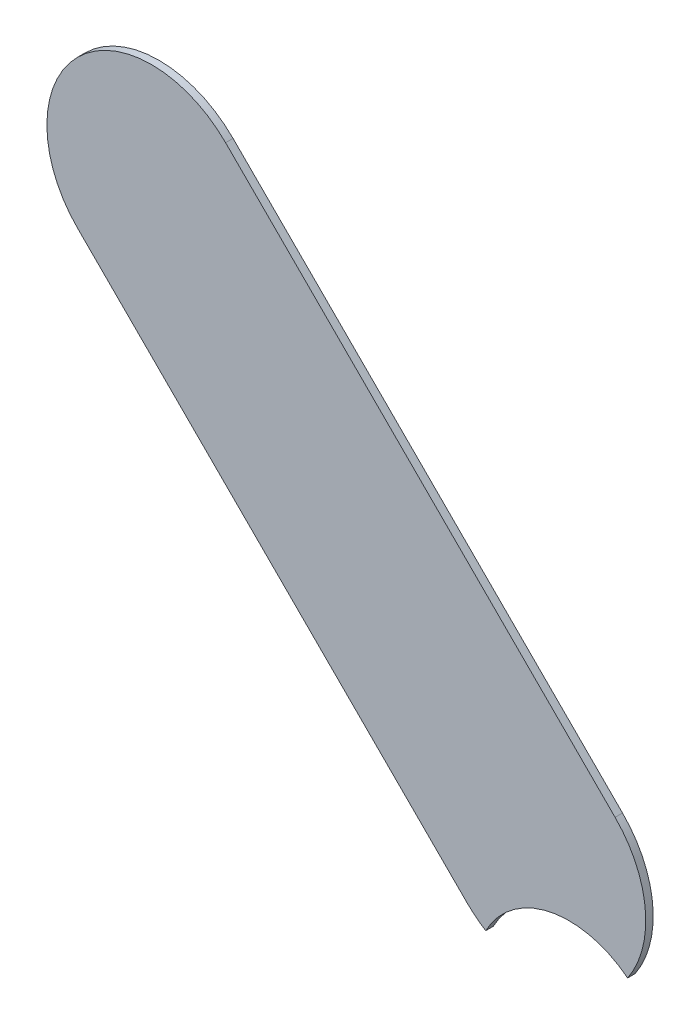
ISO-10303-21;
HEADER;
FILE_DESCRIPTION(('STEP AP214'),'2;1');
FILE_NAME('part.step','',(''),(''),'','','');
FILE_SCHEMA(('AUTOMOTIVE_DESIGN { 1 0 10303 214 1 1 1 1 }'));
ENDSEC;
DATA;
#1=APPLICATION_CONTEXT('core data for automotive mechanical design processes');
#2=APPLICATION_PROTOCOL_DEFINITION('international standard','automotive_design',2000,#1);
#3=PRODUCT_CONTEXT('',#1,'mechanical');
#4=PRODUCT('Part','Part','',(#3));
#5=PRODUCT_RELATED_PRODUCT_CATEGORY('part','',(#4));
#6=PRODUCT_DEFINITION_FORMATION('','',#4);
#7=PRODUCT_DEFINITION_CONTEXT('part definition',#1,'design');
#8=PRODUCT_DEFINITION('design','',#6,#7);
#9=PRODUCT_DEFINITION_SHAPE('','',#8);
#10=(LENGTH_UNIT() NAMED_UNIT(*) SI_UNIT(.MILLI.,.METRE.));
#11=(NAMED_UNIT(*) PLANE_ANGLE_UNIT() SI_UNIT($,.RADIAN.));
#12=(NAMED_UNIT(*) SI_UNIT($,.STERADIAN.) SOLID_ANGLE_UNIT());
#13=UNCERTAINTY_MEASURE_WITH_UNIT(LENGTH_MEASURE(1.E-05),#10,'distance_accuracy_value','');
#14=(GEOMETRIC_REPRESENTATION_CONTEXT(3) GLOBAL_UNCERTAINTY_ASSIGNED_CONTEXT((#13)) GLOBAL_UNIT_ASSIGNED_CONTEXT((#10,
#11,#12)) REPRESENTATION_CONTEXT('',''));
#15=CARTESIAN_POINT('',(0.,0.,0.));
#16=DIRECTION('',(0.,0.,1.));
#17=DIRECTION('',(1.,0.,0.));
#18=AXIS2_PLACEMENT_3D('',#15,#16,#17);
#19=CARTESIAN_POINT('',(43.65225712,70.54063616,0.));
#20=DIRECTION('',(0.707106781186548,0.707106781186548,0.));
#21=DIRECTION('',(0.707106781186548,-0.707106781186548,0.));
#22=AXIS2_PLACEMENT_3D('',#19,#20,#21);
#23=PLANE('',#22);
#24=DIRECTION('',(0.707106781186548,-0.707106781186548,0.));
#25=VECTOR('',#24,1.);
#26=CARTESIAN_POINT('',(43.65225712,70.54063616,0.03556));
#27=LINE('',#26,#25);
#28=CARTESIAN_POINT('',(43.65225712,70.54063616,0.03556));
#29=VERTEX_POINT('',#28);
#30=CARTESIAN_POINT('',(45.5125201,68.68037318,0.03556));
#31=VERTEX_POINT('',#30);
#32=EDGE_CURVE('E11',#29,#31,#27,.T.);
#33=ORIENTED_EDGE('',*,*,#32,.F.);
#34=DIRECTION('',(0.,0.,1.));
#35=VECTOR('',#34,1.);
#36=CARTESIAN_POINT('',(43.65225712,70.54063616,0.));
#37=LINE('',#36,#35);
#38=CARTESIAN_POINT('',(43.65225712,70.54063616,0.));
#39=VERTEX_POINT('',#38);
#40=EDGE_CURVE('E24',#39,#29,#37,.T.);
#41=ORIENTED_EDGE('',*,*,#40,.F.);
#42=DIRECTION('',(0.707106781186548,-0.707106781186548,0.));
#43=VECTOR('',#42,1.);
#44=CARTESIAN_POINT('',(43.65225712,70.54063616,0.));
#45=LINE('',#44,#43);
#46=CARTESIAN_POINT('',(45.5125201,68.68037318,0.));
#47=VERTEX_POINT('',#46);
#48=EDGE_CURVE('E88',#39,#47,#45,.T.);
#49=ORIENTED_EDGE('',*,*,#48,.T.);
#50=DIRECTION('',(0.,0.,1.));
#51=VECTOR('',#50,1.);
#52=CARTESIAN_POINT('',(45.5125201,68.68037318,0.));
#53=LINE('',#52,#51);
#54=EDGE_CURVE('E37',#47,#31,#53,.T.);
#55=ORIENTED_EDGE('',*,*,#54,.T.);
#56=EDGE_LOOP('',(#33,#41,#49,#55));
#57=FACE_BOUND('',#56,.T.);
#58=ADVANCED_FACE('F17',(#57),#23,.F.);
#59=CARTESIAN_POINT('',(45.86607286,69.03392594,0.));
#60=DIRECTION('',(0.,0.,-1.));
#61=DIRECTION('',(-0.707106781186548,-0.707106781186548,0.));
#62=AXIS2_PLACEMENT_3D('',#59,#60,#61);
#63=CYLINDRICAL_SURFACE('',#62,0.499999108206442);
#64=CARTESIAN_POINT('',(45.86607286,69.03392594,0.03556));
#65=DIRECTION('',(0.,0.,1.));
#66=DIRECTION('',(-0.707106781186548,-0.707106781186548,0.));
#67=AXIS2_PLACEMENT_3D('',#64,#65,#66);
#68=CIRCLE('',#67,0.499999108206442);
#69=CARTESIAN_POINT('',(45.6017477531662,68.6095071066472,0.03556));
#70=VERTEX_POINT('',#69);
#71=EDGE_CURVE('E111',#31,#70,#68,.T.);
#72=ORIENTED_EDGE('',*,*,#71,.F.);
#73=ORIENTED_EDGE('',*,*,#54,.F.);
#74=CARTESIAN_POINT('',(45.86607286,69.03392594,0.));
#75=DIRECTION('',(0.,0.,1.));
#76=DIRECTION('',(-0.707106781186548,-0.707106781186548,0.));
#77=AXIS2_PLACEMENT_3D('',#74,#75,#76);
#78=CIRCLE('',#77,0.499999108206442);
#79=CARTESIAN_POINT('',(45.6017477531662,68.6095071066472,0.));
#80=VERTEX_POINT('',#79);
#81=EDGE_CURVE('E108',#47,#80,#78,.T.);
#82=ORIENTED_EDGE('',*,*,#81,.T.);
#83=DIRECTION('',(0.,0.,1.));
#84=VECTOR('',#83,1.);
#85=CARTESIAN_POINT('',(45.6017477531662,68.6095071066472,0.));
#86=LINE('',#85,#84);
#87=EDGE_CURVE('E106',#80,#70,#86,.T.);
#88=ORIENTED_EDGE('',*,*,#87,.T.);
#89=EDGE_LOOP('',(#72,#73,#82,#88));
#90=FACE_BOUND('',#89,.T.);
#91=ADVANCED_FACE('F118',(#90),#63,.T.);
#92=CARTESIAN_POINT('',(46.0000096,68.4000156,0.));
#93=DIRECTION('',(0.,0.,-1.));
#94=DIRECTION('',(1.,0.,0.));
#95=AXIS2_PLACEMENT_3D('',#92,#93,#94);
#96=CYLINDRICAL_SURFACE('',#95,0.4499991);
#97=DIRECTION('',(0.,0.,1.));
#98=VECTOR('',#97,1.);
#99=CARTESIAN_POINT('',(46.279490177413,68.752704977285,0.));
#100=LINE('',#99,#98);
#101=CARTESIAN_POINT('',(46.279490177413,68.752704977285,0.));
#102=VERTEX_POINT('',#101);
#103=CARTESIAN_POINT('',(46.279490177413,68.752704977285,0.03556));
#104=VERTEX_POINT('',#103);
#105=EDGE_CURVE('E104',#102,#104,#100,.T.);
#106=ORIENTED_EDGE('',*,*,#105,.T.);
#107=CARTESIAN_POINT('',(46.0000096,68.4000156,0.03556));
#108=DIRECTION('',(0.,0.,1.));
#109=DIRECTION('',(1.,0.,0.));
#110=AXIS2_PLACEMENT_3D('',#107,#108,#109);
#111=CIRCLE('',#110,0.4499991);
#112=EDGE_CURVE('E101',#104,#70,#111,.T.);
#113=ORIENTED_EDGE('',*,*,#112,.T.);
#114=ORIENTED_EDGE('',*,*,#87,.F.);
#115=CARTESIAN_POINT('',(46.0000096,68.4000156,0.));
#116=DIRECTION('',(0.,0.,1.));
#117=DIRECTION('',(1.,0.,0.));
#118=AXIS2_PLACEMENT_3D('',#115,#116,#117);
#119=CIRCLE('',#118,0.4499991);
#120=EDGE_CURVE('E98',#102,#80,#119,.T.);
#121=ORIENTED_EDGE('',*,*,#120,.F.);
#122=EDGE_LOOP('',(#106,#113,#114,#121));
#123=FACE_BOUND('',#122,.T.);
#124=ADVANCED_FACE('F124',(#123),#96,.F.);
#125=CARTESIAN_POINT('',(45.86607286,69.03392594,0.));
#126=DIRECTION('',(0.,0.,-1.));
#127=DIRECTION('',(-0.707106781186548,-0.707106781186548,0.));
#128=AXIS2_PLACEMENT_3D('',#125,#126,#127);
#129=CYLINDRICAL_SURFACE('',#128,0.499999108206442);
#130=CARTESIAN_POINT('',(45.86607286,69.03392594,0.03556));
#131=DIRECTION('',(0.,0.,1.));
#132=DIRECTION('',(-0.707106781186548,-0.707106781186548,0.));
#133=AXIS2_PLACEMENT_3D('',#130,#131,#132);
#134=CIRCLE('',#133,0.499999108206442);
#135=CARTESIAN_POINT('',(46.21962562,69.3874787,0.03556));
#136=VERTEX_POINT('',#135);
#137=EDGE_CURVE('E95',#104,#136,#134,.T.);
#138=ORIENTED_EDGE('',*,*,#137,.F.);
#139=ORIENTED_EDGE('',*,*,#105,.F.);
#140=CARTESIAN_POINT('',(46.21962562,69.3874787,0.));
#141=VERTEX_POINT('',#140);
#142=EDGE_CURVE('E94',#102,#141,#78,.T.);
#143=ORIENTED_EDGE('',*,*,#142,.T.);
#144=DIRECTION('',(0.,0.,1.));
#145=VECTOR('',#144,1.);
#146=CARTESIAN_POINT('',(46.21962562,69.3874787,0.));
#147=LINE('',#146,#145);
#148=EDGE_CURVE('E79',#141,#136,#147,.T.);
#149=ORIENTED_EDGE('',*,*,#148,.T.);
#150=EDGE_LOOP('',(#138,#139,#143,#149));
#151=FACE_BOUND('',#150,.T.);
#152=ADVANCED_FACE('F126',(#151),#129,.T.);
#153=CARTESIAN_POINT('',(46.21962562,69.3874787,0.));
#154=DIRECTION('',(-0.707106781186548,-0.707106781186548,0.));
#155=DIRECTION('',(-0.707106781186548,0.707106781186548,0.));
#156=AXIS2_PLACEMENT_3D('',#153,#154,#155);
#157=PLANE('',#156);
#158=DIRECTION('',(-0.707106781186548,0.707106781186548,0.));
#159=VECTOR('',#158,1.);
#160=CARTESIAN_POINT('',(46.21962562,69.3874787,0.03556));
#161=LINE('',#160,#159);
#162=CARTESIAN_POINT('',(44.35936264,71.24774168,0.03556));
#163=VERTEX_POINT('',#162);
#164=EDGE_CURVE('E83',#136,#163,#161,.T.);
#165=ORIENTED_EDGE('',*,*,#164,.F.);
#166=ORIENTED_EDGE('',*,*,#148,.F.);
#167=DIRECTION('',(-0.707106781186548,0.707106781186548,0.));
#168=VECTOR('',#167,1.);
#169=CARTESIAN_POINT('',(46.21962562,69.3874787,0.));
#170=LINE('',#169,#168);
#171=CARTESIAN_POINT('',(44.35936264,71.24774168,0.));
#172=VERTEX_POINT('',#171);
#173=EDGE_CURVE('E75',#141,#172,#170,.T.);
#174=ORIENTED_EDGE('',*,*,#173,.T.);
#175=DIRECTION('',(0.,0.,1.));
#176=VECTOR('',#175,1.);
#177=CARTESIAN_POINT('',(44.35936264,71.24774168,0.));
#178=LINE('',#177,#176);
#179=EDGE_CURVE('E65',#172,#163,#178,.T.);
#180=ORIENTED_EDGE('',*,*,#179,.T.);
#181=EDGE_LOOP('',(#165,#166,#174,#180));
#182=FACE_BOUND('',#181,.T.);
#183=ADVANCED_FACE('F78',(#182),#157,.F.);
#184=CARTESIAN_POINT('',(44.00580988,70.89418892,0.));
#185=DIRECTION('',(0.,0.,-1.));
#186=DIRECTION('',(0.707106781186548,0.707106781186548,0.));
#187=AXIS2_PLACEMENT_3D('',#184,#185,#186);
#188=CYLINDRICAL_SURFACE('',#187,0.499999108206442);
#189=CARTESIAN_POINT('',(44.00580988,70.89418892,0.03556));
#190=DIRECTION('',(0.,0.,1.));
#191=DIRECTION('',(0.707106781186548,0.707106781186548,0.));
#192=AXIS2_PLACEMENT_3D('',#189,#190,#191);
#193=CIRCLE('',#192,0.499999108206442);
#194=EDGE_CURVE('E71',#163,#29,#193,.T.);
#195=ORIENTED_EDGE('',*,*,#194,.F.);
#196=ORIENTED_EDGE('',*,*,#179,.F.);
#197=CARTESIAN_POINT('',(44.00580988,70.89418892,0.));
#198=DIRECTION('',(0.,0.,1.));
#199=DIRECTION('',(0.707106781186548,0.707106781186548,0.));
#200=AXIS2_PLACEMENT_3D('',#197,#198,#199);
#201=CIRCLE('',#200,0.499999108206442);
#202=EDGE_CURVE('E69',#172,#39,#201,.T.);
#203=ORIENTED_EDGE('',*,*,#202,.T.);
#204=ORIENTED_EDGE('',*,*,#40,.T.);
#205=EDGE_LOOP('',(#195,#196,#203,#204));
#206=FACE_BOUND('',#205,.T.);
#207=ADVANCED_FACE('F67',(#206),#188,.T.);
#208=CARTESIAN_POINT('',(43.65225712,70.54063616,0.));
#209=DIRECTION('',(0.,0.,-1.));
#210=DIRECTION('',(-1.,0.,0.));
#211=AXIS2_PLACEMENT_3D('',#208,#209,#210);
#212=PLANE('',#211);
#213=ORIENTED_EDGE('',*,*,#48,.F.);
#214=ORIENTED_EDGE('',*,*,#202,.F.);
#215=ORIENTED_EDGE('',*,*,#173,.F.);
#216=ORIENTED_EDGE('',*,*,#142,.F.);
#217=ORIENTED_EDGE('',*,*,#120,.T.);
#218=ORIENTED_EDGE('',*,*,#81,.F.);
#219=EDGE_LOOP('',(#213,#214,#215,#216,#217,#218));
#220=FACE_BOUND('',#219,.T.);
#221=ADVANCED_FACE('F86',(#220),#212,.T.);
#222=CARTESIAN_POINT('',(43.65225712,70.54063616,0.03556));
#223=DIRECTION('',(0.,0.,-1.));
#224=DIRECTION('',(-1.,0.,0.));
#225=AXIS2_PLACEMENT_3D('',#222,#223,#224);
#226=PLANE('',#225);
#227=ORIENTED_EDGE('',*,*,#194,.T.);
#228=ORIENTED_EDGE('',*,*,#32,.T.);
#229=ORIENTED_EDGE('',*,*,#71,.T.);
#230=ORIENTED_EDGE('',*,*,#112,.F.);
#231=ORIENTED_EDGE('',*,*,#137,.T.);
#232=ORIENTED_EDGE('',*,*,#164,.T.);
#233=EDGE_LOOP('',(#227,#228,#229,#230,#231,#232));
#234=FACE_BOUND('',#233,.T.);
#235=ADVANCED_FACE('F121',(#234),#226,.F.);
#236=CLOSED_SHELL('',(#58,#91,#124,#152,#183,#207,#221,#235));
#237=MANIFOLD_SOLID_BREP('B1',#236);
#238=ADVANCED_BREP_SHAPE_REPRESENTATION('',(#18,#237),#14);
#239=SHAPE_DEFINITION_REPRESENTATION(#9,#238);
ENDSEC;
END-ISO-10303-21;
